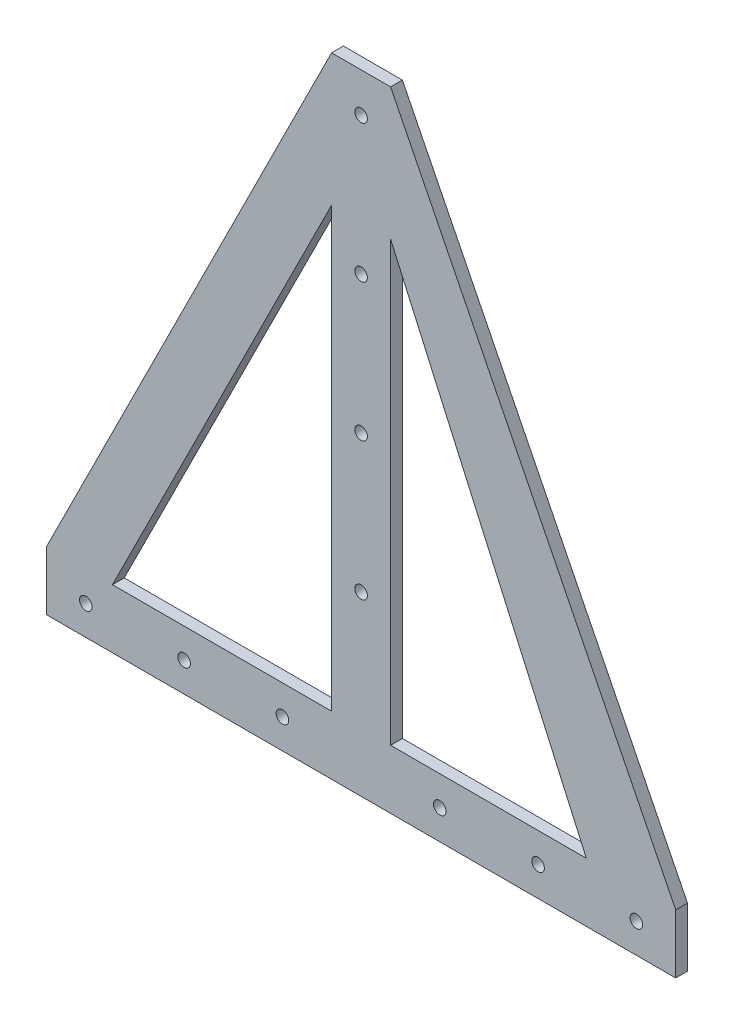
ISO-10303-21;
HEADER;
FILE_DESCRIPTION(('STEP AP214'),'2;1');
FILE_NAME('part.step','',(''),(''),'','','');
FILE_SCHEMA(('AUTOMOTIVE_DESIGN { 1 0 10303 214 1 1 1 1 }'));
ENDSEC;
DATA;
#1=APPLICATION_CONTEXT('core data for automotive mechanical design processes');
#2=APPLICATION_PROTOCOL_DEFINITION('international standard','automotive_design',2000,#1);
#3=PRODUCT_CONTEXT('',#1,'mechanical');
#4=PRODUCT('Part','Part','',(#3));
#5=PRODUCT_RELATED_PRODUCT_CATEGORY('part','',(#4));
#6=PRODUCT_DEFINITION_FORMATION('','',#4);
#7=PRODUCT_DEFINITION_CONTEXT('part definition',#1,'design');
#8=PRODUCT_DEFINITION('design','',#6,#7);
#9=PRODUCT_DEFINITION_SHAPE('','',#8);
#10=(LENGTH_UNIT() NAMED_UNIT(*) SI_UNIT(.MILLI.,.METRE.));
#11=(NAMED_UNIT(*) PLANE_ANGLE_UNIT() SI_UNIT($,.RADIAN.));
#12=(NAMED_UNIT(*) SI_UNIT($,.STERADIAN.) SOLID_ANGLE_UNIT());
#13=UNCERTAINTY_MEASURE_WITH_UNIT(LENGTH_MEASURE(1.E-05),#10,'distance_accuracy_value','');
#14=(GEOMETRIC_REPRESENTATION_CONTEXT(3) GLOBAL_UNCERTAINTY_ASSIGNED_CONTEXT((#13)) GLOBAL_UNIT_ASSIGNED_CONTEXT((#10,
#11,#12)) REPRESENTATION_CONTEXT('',''));
#15=CARTESIAN_POINT('',(0.,0.,0.));
#16=DIRECTION('',(0.,0.,1.));
#17=DIRECTION('',(1.,0.,0.));
#18=AXIS2_PLACEMENT_3D('',#15,#16,#17);
#19=CARTESIAN_POINT('',(0.,0.,3.));
#20=DIRECTION('',(0.,0.,-1.));
#21=DIRECTION('',(-1.,0.,0.));
#22=AXIS2_PLACEMENT_3D('',#19,#20,#21);
#23=PLANE('',#22);
#24=CARTESIAN_POINT('',(80.0000000000011,45.,3.));
#25=DIRECTION('',(0.,0.,1.));
#26=DIRECTION('',(1.,0.,0.));
#27=AXIS2_PLACEMENT_3D('',#24,#25,#26);
#28=CIRCLE('',#27,1.6);
#29=CARTESIAN_POINT('',(81.6000000000011,45.,3.));
#30=VERTEX_POINT('',#29);
#31=EDGE_CURVE('E149',#30,#30,#28,.T.);
#32=ORIENTED_EDGE('',*,*,#31,.F.);
#33=EDGE_LOOP('',(#32));
#34=FACE_BOUND('',#33,.T.);
#35=CARTESIAN_POINT('',(80.0000000000004,115.,3.));
#36=DIRECTION('',(0.,0.,1.));
#37=DIRECTION('',(1.,0.,0.));
#38=AXIS2_PLACEMENT_3D('',#35,#36,#37);
#39=CIRCLE('',#38,1.6);
#40=CARTESIAN_POINT('',(81.6000000000004,115.,3.));
#41=VERTEX_POINT('',#40);
#42=EDGE_CURVE('E161',#41,#41,#39,.T.);
#43=ORIENTED_EDGE('',*,*,#42,.F.);
#44=EDGE_LOOP('',(#43));
#45=FACE_BOUND('',#44,.T.);
#46=CARTESIAN_POINT('',(80.,150.,3.));
#47=DIRECTION('',(0.,0.,1.));
#48=DIRECTION('',(1.,0.,0.));
#49=AXIS2_PLACEMENT_3D('',#46,#47,#48);
#50=CIRCLE('',#49,1.6);
#51=CARTESIAN_POINT('',(81.6,150.,3.));
#52=VERTEX_POINT('',#51);
#53=EDGE_CURVE('E191',#52,#52,#50,.T.);
#54=ORIENTED_EDGE('',*,*,#53,.F.);
#55=EDGE_LOOP('',(#54));
#56=FACE_BOUND('',#55,.T.);
#57=CARTESIAN_POINT('',(35.,7.49999999999983,3.));
#58=DIRECTION('',(0.,0.,1.));
#59=DIRECTION('',(-1.,0.,0.));
#60=AXIS2_PLACEMENT_3D('',#57,#58,#59);
#61=CIRCLE('',#60,1.59999999999999);
#62=CARTESIAN_POINT('',(33.4,7.49999999999983,3.));
#63=VERTEX_POINT('',#62);
#64=EDGE_CURVE('E203',#63,#63,#61,.T.);
#65=ORIENTED_EDGE('',*,*,#64,.F.);
#66=EDGE_LOOP('',(#65));
#67=FACE_BOUND('',#66,.T.);
#68=CARTESIAN_POINT('',(125.,7.49999999999983,3.));
#69=DIRECTION('',(0.,0.,1.));
#70=DIRECTION('',(1.,0.,0.));
#71=AXIS2_PLACEMENT_3D('',#68,#69,#70);
#72=CIRCLE('',#71,1.59999999999999);
#73=CARTESIAN_POINT('',(126.6,7.49999999999983,3.));
#74=VERTEX_POINT('',#73);
#75=EDGE_CURVE('E215',#74,#74,#72,.T.);
#76=ORIENTED_EDGE('',*,*,#75,.F.);
#77=EDGE_LOOP('',(#76));
#78=FACE_BOUND('',#77,.T.);
#79=CARTESIAN_POINT('',(150.,7.5,3.));
#80=DIRECTION('',(0.,0.,1.));
#81=DIRECTION('',(1.,0.,0.));
#82=AXIS2_PLACEMENT_3D('',#79,#80,#81);
#83=CIRCLE('',#82,1.59999999999999);
#84=CARTESIAN_POINT('',(151.6,7.5,3.));
#85=VERTEX_POINT('',#84);
#86=EDGE_CURVE('E227',#85,#85,#83,.T.);
#87=ORIENTED_EDGE('',*,*,#86,.F.);
#88=EDGE_LOOP('',(#87));
#89=FACE_BOUND('',#88,.T.);
#90=DIRECTION('',(0.,-1.,0.));
#91=VECTOR('',#90,1.);
#92=CARTESIAN_POINT('',(0.,0.,3.));
#93=LINE('',#92,#91);
#94=CARTESIAN_POINT('',(0.,15.,3.));
#95=VERTEX_POINT('',#94);
#96=CARTESIAN_POINT('',(0.,0.,3.));
#97=VERTEX_POINT('',#96);
#98=EDGE_CURVE('E233',#95,#97,#93,.T.);
#99=ORIENTED_EDGE('',*,*,#98,.T.);
#100=DIRECTION('',(1.,0.,0.));
#101=VECTOR('',#100,1.);
#102=CARTESIAN_POINT('',(0.,0.,3.));
#103=LINE('',#102,#101);
#104=CARTESIAN_POINT('',(160.,0.,3.));
#105=VERTEX_POINT('',#104);
#106=EDGE_CURVE('E236',#97,#105,#103,.T.);
#107=ORIENTED_EDGE('',*,*,#106,.T.);
#108=DIRECTION('',(0.,1.,0.));
#109=VECTOR('',#108,1.);
#110=CARTESIAN_POINT('',(160.,0.,3.));
#111=LINE('',#110,#109);
#112=CARTESIAN_POINT('',(160.,15.,3.));
#113=VERTEX_POINT('',#112);
#114=EDGE_CURVE('E239',#105,#113,#111,.T.);
#115=ORIENTED_EDGE('',*,*,#114,.T.);
#116=DIRECTION('',(-0.447213595499958,0.894427190999916,0.));
#117=VECTOR('',#116,1.);
#118=CARTESIAN_POINT('',(87.5,160.,3.));
#119=LINE('',#118,#117);
#120=CARTESIAN_POINT('',(87.5,160.,3.));
#121=VERTEX_POINT('',#120);
#122=EDGE_CURVE('E241',#113,#121,#119,.T.);
#123=ORIENTED_EDGE('',*,*,#122,.T.);
#124=DIRECTION('',(-1.,0.,0.));
#125=VECTOR('',#124,1.);
#126=CARTESIAN_POINT('',(72.5,160.,3.));
#127=LINE('',#126,#125);
#128=CARTESIAN_POINT('',(72.5,160.,3.));
#129=VERTEX_POINT('',#128);
#130=EDGE_CURVE('E243',#121,#129,#127,.T.);
#131=ORIENTED_EDGE('',*,*,#130,.T.);
#132=DIRECTION('',(-0.447213595499958,-0.894427190999916,0.));
#133=VECTOR('',#132,1.);
#134=CARTESIAN_POINT('',(0.,15.,3.));
#135=LINE('',#134,#133);
#136=EDGE_CURVE('E245',#129,#95,#135,.T.);
#137=ORIENTED_EDGE('',*,*,#136,.T.);
#138=EDGE_LOOP('',(#99,#107,#115,#123,#131,#137));
#139=FACE_BOUND('',#138,.T.);
#140=CARTESIAN_POINT('',(10.,7.5,3.));
#141=DIRECTION('',(0.,0.,1.));
#142=DIRECTION('',(-1.,0.,0.));
#143=AXIS2_PLACEMENT_3D('',#140,#141,#142);
#144=CIRCLE('',#143,1.59999999999999);
#145=CARTESIAN_POINT('',(8.40000000000002,7.5,3.));
#146=VERTEX_POINT('',#145);
#147=EDGE_CURVE('E221',#146,#146,#144,.T.);
#148=ORIENTED_EDGE('',*,*,#147,.F.);
#149=EDGE_LOOP('',(#148));
#150=FACE_BOUND('',#149,.T.);
#151=CARTESIAN_POINT('',(100.,7.49999999999965,3.));
#152=DIRECTION('',(0.,0.,1.));
#153=DIRECTION('',(1.,0.,0.));
#154=AXIS2_PLACEMENT_3D('',#151,#152,#153);
#155=CIRCLE('',#154,1.59999999999999);
#156=CARTESIAN_POINT('',(101.6,7.49999999999965,3.));
#157=VERTEX_POINT('',#156);
#158=EDGE_CURVE('E209',#157,#157,#155,.T.);
#159=ORIENTED_EDGE('',*,*,#158,.F.);
#160=EDGE_LOOP('',(#159));
#161=FACE_BOUND('',#160,.T.);
#162=CARTESIAN_POINT('',(60.,7.49999999999965,3.));
#163=DIRECTION('',(0.,0.,1.));
#164=DIRECTION('',(-1.,0.,0.));
#165=AXIS2_PLACEMENT_3D('',#162,#163,#164);
#166=CIRCLE('',#165,1.59999999999999);
#167=CARTESIAN_POINT('',(58.4,7.49999999999965,3.));
#168=VERTEX_POINT('',#167);
#169=EDGE_CURVE('E197',#168,#168,#166,.T.);
#170=ORIENTED_EDGE('',*,*,#169,.F.);
#171=EDGE_LOOP('',(#170));
#172=FACE_BOUND('',#171,.T.);
#173=DIRECTION('',(-0.447213595499958,-0.894427190999916,0.));
#174=VECTOR('',#173,1.);
#175=CARTESIAN_POINT('',(16.7705098312484,15.,3.));
#176=LINE('',#175,#174);
#177=CARTESIAN_POINT('',(72.5,126.458980337503,3.));
#178=VERTEX_POINT('',#177);
#179=CARTESIAN_POINT('',(16.7705098312484,15.,3.));
#180=VERTEX_POINT('',#179);
#181=EDGE_CURVE('E167',#178,#180,#176,.T.);
#182=ORIENTED_EDGE('',*,*,#181,.F.);
#183=DIRECTION('',(0.,1.,0.));
#184=VECTOR('',#183,1.);
#185=CARTESIAN_POINT('',(72.5,126.458980337503,3.));
#186=LINE('',#185,#184);
#187=CARTESIAN_POINT('',(72.5,15.,3.));
#188=VERTEX_POINT('',#187);
#189=EDGE_CURVE('E173',#188,#178,#186,.T.);
#190=ORIENTED_EDGE('',*,*,#189,.F.);
#191=DIRECTION('',(1.,0.,0.));
#192=VECTOR('',#191,1.);
#193=CARTESIAN_POINT('',(72.5,15.,3.));
#194=LINE('',#193,#192);
#195=EDGE_CURVE('E169',#180,#188,#194,.T.);
#196=ORIENTED_EDGE('',*,*,#195,.F.);
#197=EDGE_LOOP('',(#182,#190,#196));
#198=FACE_BOUND('',#197,.T.);
#199=CARTESIAN_POINT('',(80.0000000000007,80.,3.));
#200=DIRECTION('',(0.,0.,1.));
#201=DIRECTION('',(1.,0.,0.));
#202=AXIS2_PLACEMENT_3D('',#199,#200,#201);
#203=CIRCLE('',#202,1.6);
#204=CARTESIAN_POINT('',(81.6000000000007,80.,3.));
#205=VERTEX_POINT('',#204);
#206=EDGE_CURVE('E155',#205,#205,#203,.T.);
#207=ORIENTED_EDGE('',*,*,#206,.F.);
#208=EDGE_LOOP('',(#207));
#209=FACE_BOUND('',#208,.T.);
#210=DIRECTION('',(0.,-1.,0.));
#211=VECTOR('',#210,1.);
#212=CARTESIAN_POINT('',(87.5,126.458980337503,3.));
#213=LINE('',#212,#211);
#214=CARTESIAN_POINT('',(87.5,126.458980337503,3.));
#215=VERTEX_POINT('',#214);
#216=CARTESIAN_POINT('',(87.5,15.,3.));
#217=VERTEX_POINT('',#216);
#218=EDGE_CURVE('E122',#215,#217,#213,.T.);
#219=ORIENTED_EDGE('',*,*,#218,.F.);
#220=DIRECTION('',(-0.407739813546904,0.913098157072248,0.));
#221=VECTOR('',#220,1.);
#222=CARTESIAN_POINT('',(137.271498834978,15.,3.));
#223=LINE('',#222,#221);
#224=CARTESIAN_POINT('',(137.271498834978,15.,3.));
#225=VERTEX_POINT('',#224);
#226=EDGE_CURVE('E139',#225,#215,#223,.T.);
#227=ORIENTED_EDGE('',*,*,#226,.F.);
#228=DIRECTION('',(1.,0.,0.));
#229=VECTOR('',#228,1.);
#230=CARTESIAN_POINT('',(87.5,15.,3.));
#231=LINE('',#230,#229);
#232=EDGE_CURVE('E130',#217,#225,#231,.T.);
#233=ORIENTED_EDGE('',*,*,#232,.F.);
#234=EDGE_LOOP('',(#219,#227,#233));
#235=FACE_BOUND('',#234,.T.);
#236=ADVANCED_FACE('F33',(#34,#45,#56,#67,#78,#89,#139,#150,#161,#172,#198,#209,#235),#23,.F.);
#237=CARTESIAN_POINT('',(0.,0.,0.));
#238=DIRECTION('',(0.,0.,-1.));
#239=DIRECTION('',(-1.,0.,0.));
#240=AXIS2_PLACEMENT_3D('',#237,#238,#239);
#241=PLANE('',#240);
#242=CARTESIAN_POINT('',(80.0000000000011,45.,0.));
#243=DIRECTION('',(0.,0.,1.));
#244=DIRECTION('',(1.,0.,0.));
#245=AXIS2_PLACEMENT_3D('',#242,#243,#244);
#246=CIRCLE('',#245,1.6);
#247=CARTESIAN_POINT('',(81.6000000000011,45.,0.));
#248=VERTEX_POINT('',#247);
#249=EDGE_CURVE('E137',#248,#248,#246,.T.);
#250=ORIENTED_EDGE('',*,*,#249,.T.);
#251=EDGE_LOOP('',(#250));
#252=FACE_BOUND('',#251,.T.);
#253=CARTESIAN_POINT('',(80.0000000000004,115.,0.));
#254=DIRECTION('',(0.,0.,1.));
#255=DIRECTION('',(1.,0.,0.));
#256=AXIS2_PLACEMENT_3D('',#253,#254,#255);
#257=CIRCLE('',#256,1.6);
#258=CARTESIAN_POINT('',(81.6000000000004,115.,0.));
#259=VERTEX_POINT('',#258);
#260=EDGE_CURVE('E158',#259,#259,#257,.T.);
#261=ORIENTED_EDGE('',*,*,#260,.T.);
#262=EDGE_LOOP('',(#261));
#263=FACE_BOUND('',#262,.T.);
#264=CARTESIAN_POINT('',(80.,150.,0.));
#265=DIRECTION('',(0.,0.,1.));
#266=DIRECTION('',(1.,0.,0.));
#267=AXIS2_PLACEMENT_3D('',#264,#265,#266);
#268=CIRCLE('',#267,1.6);
#269=CARTESIAN_POINT('',(81.6,150.,0.));
#270=VERTEX_POINT('',#269);
#271=EDGE_CURVE('E190',#270,#270,#268,.T.);
#272=ORIENTED_EDGE('',*,*,#271,.T.);
#273=EDGE_LOOP('',(#272));
#274=FACE_BOUND('',#273,.T.);
#275=CARTESIAN_POINT('',(35.,7.49999999999983,0.));
#276=DIRECTION('',(0.,0.,1.));
#277=DIRECTION('',(-1.,0.,0.));
#278=AXIS2_PLACEMENT_3D('',#275,#276,#277);
#279=CIRCLE('',#278,1.59999999999999);
#280=CARTESIAN_POINT('',(33.4,7.49999999999983,0.));
#281=VERTEX_POINT('',#280);
#282=EDGE_CURVE('E200',#281,#281,#279,.T.);
#283=ORIENTED_EDGE('',*,*,#282,.T.);
#284=EDGE_LOOP('',(#283));
#285=FACE_BOUND('',#284,.T.);
#286=CARTESIAN_POINT('',(125.,7.49999999999983,0.));
#287=DIRECTION('',(0.,0.,1.));
#288=DIRECTION('',(1.,0.,0.));
#289=AXIS2_PLACEMENT_3D('',#286,#287,#288);
#290=CIRCLE('',#289,1.59999999999999);
#291=CARTESIAN_POINT('',(126.6,7.49999999999983,0.));
#292=VERTEX_POINT('',#291);
#293=EDGE_CURVE('E212',#292,#292,#290,.T.);
#294=ORIENTED_EDGE('',*,*,#293,.T.);
#295=EDGE_LOOP('',(#294));
#296=FACE_BOUND('',#295,.T.);
#297=CARTESIAN_POINT('',(150.,7.5,0.));
#298=DIRECTION('',(0.,0.,1.));
#299=DIRECTION('',(1.,0.,0.));
#300=AXIS2_PLACEMENT_3D('',#297,#298,#299);
#301=CIRCLE('',#300,1.59999999999999);
#302=CARTESIAN_POINT('',(151.6,7.5,0.));
#303=VERTEX_POINT('',#302);
#304=EDGE_CURVE('E224',#303,#303,#301,.T.);
#305=ORIENTED_EDGE('',*,*,#304,.T.);
#306=EDGE_LOOP('',(#305));
#307=FACE_BOUND('',#306,.T.);
#308=DIRECTION('',(0.,-1.,0.));
#309=VECTOR('',#308,1.);
#310=CARTESIAN_POINT('',(0.,0.,0.));
#311=LINE('',#310,#309);
#312=CARTESIAN_POINT('',(0.,15.,0.));
#313=VERTEX_POINT('',#312);
#314=CARTESIAN_POINT('',(0.,0.,0.));
#315=VERTEX_POINT('',#314);
#316=EDGE_CURVE('E230',#313,#315,#311,.T.);
#317=ORIENTED_EDGE('',*,*,#316,.F.);
#318=DIRECTION('',(-0.447213595499958,-0.894427190999916,0.));
#319=VECTOR('',#318,1.);
#320=CARTESIAN_POINT('',(0.,15.,0.));
#321=LINE('',#320,#319);
#322=CARTESIAN_POINT('',(72.5,160.,0.));
#323=VERTEX_POINT('',#322);
#324=EDGE_CURVE('E237',#323,#313,#321,.T.);
#325=ORIENTED_EDGE('',*,*,#324,.F.);
#326=DIRECTION('',(-1.,0.,0.));
#327=VECTOR('',#326,1.);
#328=CARTESIAN_POINT('',(72.5,160.,0.));
#329=LINE('',#328,#327);
#330=CARTESIAN_POINT('',(87.5,160.,0.));
#331=VERTEX_POINT('',#330);
#332=EDGE_CURVE('E256',#331,#323,#329,.T.);
#333=ORIENTED_EDGE('',*,*,#332,.F.);
#334=DIRECTION('',(-0.447213595499958,0.894427190999916,0.));
#335=VECTOR('',#334,1.);
#336=CARTESIAN_POINT('',(87.5,160.,0.));
#337=LINE('',#336,#335);
#338=CARTESIAN_POINT('',(160.,15.,0.));
#339=VERTEX_POINT('',#338);
#340=EDGE_CURVE('E254',#339,#331,#337,.T.);
#341=ORIENTED_EDGE('',*,*,#340,.F.);
#342=DIRECTION('',(0.,1.,0.));
#343=VECTOR('',#342,1.);
#344=CARTESIAN_POINT('',(160.,0.,0.));
#345=LINE('',#344,#343);
#346=CARTESIAN_POINT('',(160.,0.,0.));
#347=VERTEX_POINT('',#346);
#348=EDGE_CURVE('E252',#347,#339,#345,.T.);
#349=ORIENTED_EDGE('',*,*,#348,.F.);
#350=DIRECTION('',(1.,0.,0.));
#351=VECTOR('',#350,1.);
#352=CARTESIAN_POINT('',(0.,0.,0.));
#353=LINE('',#352,#351);
#354=EDGE_CURVE('E250',#315,#347,#353,.T.);
#355=ORIENTED_EDGE('',*,*,#354,.F.);
#356=EDGE_LOOP('',(#317,#325,#333,#341,#349,#355));
#357=FACE_BOUND('',#356,.T.);
#358=CARTESIAN_POINT('',(10.,7.5,0.));
#359=DIRECTION('',(0.,0.,1.));
#360=DIRECTION('',(-1.,0.,0.));
#361=AXIS2_PLACEMENT_3D('',#358,#359,#360);
#362=CIRCLE('',#361,1.59999999999999);
#363=CARTESIAN_POINT('',(8.40000000000002,7.5,0.));
#364=VERTEX_POINT('',#363);
#365=EDGE_CURVE('E218',#364,#364,#362,.T.);
#366=ORIENTED_EDGE('',*,*,#365,.T.);
#367=EDGE_LOOP('',(#366));
#368=FACE_BOUND('',#367,.T.);
#369=CARTESIAN_POINT('',(100.,7.49999999999965,0.));
#370=DIRECTION('',(0.,0.,1.));
#371=DIRECTION('',(1.,0.,0.));
#372=AXIS2_PLACEMENT_3D('',#369,#370,#371);
#373=CIRCLE('',#372,1.59999999999999);
#374=CARTESIAN_POINT('',(101.6,7.49999999999965,0.));
#375=VERTEX_POINT('',#374);
#376=EDGE_CURVE('E206',#375,#375,#373,.T.);
#377=ORIENTED_EDGE('',*,*,#376,.T.);
#378=EDGE_LOOP('',(#377));
#379=FACE_BOUND('',#378,.T.);
#380=CARTESIAN_POINT('',(60.,7.49999999999965,0.));
#381=DIRECTION('',(0.,0.,1.));
#382=DIRECTION('',(-1.,0.,0.));
#383=AXIS2_PLACEMENT_3D('',#380,#381,#382);
#384=CIRCLE('',#383,1.59999999999999);
#385=CARTESIAN_POINT('',(58.4,7.49999999999965,0.));
#386=VERTEX_POINT('',#385);
#387=EDGE_CURVE('E194',#386,#386,#384,.T.);
#388=ORIENTED_EDGE('',*,*,#387,.T.);
#389=EDGE_LOOP('',(#388));
#390=FACE_BOUND('',#389,.T.);
#391=DIRECTION('',(0.,1.,0.));
#392=VECTOR('',#391,1.);
#393=CARTESIAN_POINT('',(72.5,126.458980337503,0.));
#394=LINE('',#393,#392);
#395=CARTESIAN_POINT('',(72.5,15.,0.));
#396=VERTEX_POINT('',#395);
#397=CARTESIAN_POINT('',(72.5,126.458980337503,0.));
#398=VERTEX_POINT('',#397);
#399=EDGE_CURVE('E170',#396,#398,#394,.T.);
#400=ORIENTED_EDGE('',*,*,#399,.T.);
#401=DIRECTION('',(-0.447213595499958,-0.894427190999916,0.));
#402=VECTOR('',#401,1.);
#403=CARTESIAN_POINT('',(16.7705098312484,15.,0.));
#404=LINE('',#403,#402);
#405=CARTESIAN_POINT('',(16.7705098312484,15.,0.));
#406=VERTEX_POINT('',#405);
#407=EDGE_CURVE('E164',#398,#406,#404,.T.);
#408=ORIENTED_EDGE('',*,*,#407,.T.);
#409=DIRECTION('',(1.,0.,0.));
#410=VECTOR('',#409,1.);
#411=CARTESIAN_POINT('',(72.5,15.,0.));
#412=LINE('',#411,#410);
#413=EDGE_CURVE('E178',#406,#396,#412,.T.);
#414=ORIENTED_EDGE('',*,*,#413,.T.);
#415=EDGE_LOOP('',(#400,#408,#414));
#416=FACE_BOUND('',#415,.T.);
#417=CARTESIAN_POINT('',(80.0000000000007,80.,0.));
#418=DIRECTION('',(0.,0.,1.));
#419=DIRECTION('',(1.,0.,0.));
#420=AXIS2_PLACEMENT_3D('',#417,#418,#419);
#421=CIRCLE('',#420,1.6);
#422=CARTESIAN_POINT('',(81.6000000000007,80.,0.));
#423=VERTEX_POINT('',#422);
#424=EDGE_CURVE('E152',#423,#423,#421,.T.);
#425=ORIENTED_EDGE('',*,*,#424,.T.);
#426=EDGE_LOOP('',(#425));
#427=FACE_BOUND('',#426,.T.);
#428=DIRECTION('',(-0.407739813546904,0.913098157072248,0.));
#429=VECTOR('',#428,1.);
#430=CARTESIAN_POINT('',(137.271498834978,15.,0.));
#431=LINE('',#430,#429);
#432=CARTESIAN_POINT('',(137.271498834978,15.,0.));
#433=VERTEX_POINT('',#432);
#434=CARTESIAN_POINT('',(87.5,126.458980337503,0.));
#435=VERTEX_POINT('',#434);
#436=EDGE_CURVE('E131',#433,#435,#431,.T.);
#437=ORIENTED_EDGE('',*,*,#436,.T.);
#438=DIRECTION('',(0.,-1.,0.));
#439=VECTOR('',#438,1.);
#440=CARTESIAN_POINT('',(87.5,126.458980337503,0.));
#441=LINE('',#440,#439);
#442=CARTESIAN_POINT('',(87.5,15.,0.));
#443=VERTEX_POINT('',#442);
#444=EDGE_CURVE('E56',#435,#443,#441,.T.);
#445=ORIENTED_EDGE('',*,*,#444,.T.);
#446=DIRECTION('',(1.,0.,0.));
#447=VECTOR('',#446,1.);
#448=CARTESIAN_POINT('',(87.5,15.,0.));
#449=LINE('',#448,#447);
#450=EDGE_CURVE('E136',#443,#433,#449,.T.);
#451=ORIENTED_EDGE('',*,*,#450,.T.);
#452=EDGE_LOOP('',(#437,#445,#451));
#453=FACE_BOUND('',#452,.T.);
#454=ADVANCED_FACE('F280',(#252,#263,#274,#285,#296,#307,#357,#368,#379,#390,#416,#427,#453),
#241,.T.);
#455=CARTESIAN_POINT('',(0.,0.,3.));
#456=DIRECTION('',(1.,0.,0.));
#457=DIRECTION('',(0.,0.,-1.));
#458=AXIS2_PLACEMENT_3D('',#455,#456,#457);
#459=PLANE('',#458);
#460=ORIENTED_EDGE('',*,*,#316,.T.);
#461=DIRECTION('',(0.,0.,-1.));
#462=VECTOR('',#461,1.);
#463=CARTESIAN_POINT('',(0.,0.,3.));
#464=LINE('',#463,#462);
#465=EDGE_CURVE('E11',#97,#315,#464,.T.);
#466=ORIENTED_EDGE('',*,*,#465,.F.);
#467=ORIENTED_EDGE('',*,*,#98,.F.);
#468=DIRECTION('',(0.,0.,-1.));
#469=VECTOR('',#468,1.);
#470=CARTESIAN_POINT('',(0.,15.,3.));
#471=LINE('',#470,#469);
#472=EDGE_CURVE('E247',#95,#313,#471,.T.);
#473=ORIENTED_EDGE('',*,*,#472,.T.);
#474=EDGE_LOOP('',(#460,#466,#467,#473));
#475=FACE_BOUND('',#474,.T.);
#476=ADVANCED_FACE('F35',(#475),#459,.F.);
#477=CARTESIAN_POINT('',(0.,0.,3.));
#478=DIRECTION('',(0.,1.,0.));
#479=DIRECTION('',(0.,0.,1.));
#480=AXIS2_PLACEMENT_3D('',#477,#478,#479);
#481=PLANE('',#480);
#482=ORIENTED_EDGE('',*,*,#354,.T.);
#483=DIRECTION('',(0.,0.,-1.));
#484=VECTOR('',#483,1.);
#485=CARTESIAN_POINT('',(160.,0.,3.));
#486=LINE('',#485,#484);
#487=EDGE_CURVE('E41',#105,#347,#486,.T.);
#488=ORIENTED_EDGE('',*,*,#487,.F.);
#489=ORIENTED_EDGE('',*,*,#106,.F.);
#490=ORIENTED_EDGE('',*,*,#465,.T.);
#491=EDGE_LOOP('',(#482,#488,#489,#490));
#492=FACE_BOUND('',#491,.T.);
#493=ADVANCED_FACE('F298',(#492),#481,.F.);
#494=CARTESIAN_POINT('',(160.,0.,3.));
#495=DIRECTION('',(-1.,0.,0.));
#496=DIRECTION('',(0.,0.,1.));
#497=AXIS2_PLACEMENT_3D('',#494,#495,#496);
#498=PLANE('',#497);
#499=ORIENTED_EDGE('',*,*,#348,.T.);
#500=DIRECTION('',(0.,0.,-1.));
#501=VECTOR('',#500,1.);
#502=CARTESIAN_POINT('',(160.,15.,3.));
#503=LINE('',#502,#501);
#504=EDGE_CURVE('E267',#113,#339,#503,.T.);
#505=ORIENTED_EDGE('',*,*,#504,.F.);
#506=ORIENTED_EDGE('',*,*,#114,.F.);
#507=ORIENTED_EDGE('',*,*,#487,.T.);
#508=EDGE_LOOP('',(#499,#505,#506,#507));
#509=FACE_BOUND('',#508,.T.);
#510=ADVANCED_FACE('F274',(#509),#498,.F.);
#511=CARTESIAN_POINT('',(87.5,160.,3.));
#512=DIRECTION('',(-0.894427190999916,-0.447213595499958,0.));
#513=DIRECTION('',(0.447213595499958,-0.894427190999916,0.));
#514=AXIS2_PLACEMENT_3D('',#511,#512,#513);
#515=PLANE('',#514);
#516=ORIENTED_EDGE('',*,*,#340,.T.);
#517=DIRECTION('',(0.,0.,-1.));
#518=VECTOR('',#517,1.);
#519=CARTESIAN_POINT('',(87.5,160.,3.));
#520=LINE('',#519,#518);
#521=EDGE_CURVE('E264',#121,#331,#520,.T.);
#522=ORIENTED_EDGE('',*,*,#521,.F.);
#523=ORIENTED_EDGE('',*,*,#122,.F.);
#524=ORIENTED_EDGE('',*,*,#504,.T.);
#525=EDGE_LOOP('',(#516,#522,#523,#524));
#526=FACE_BOUND('',#525,.T.);
#527=ADVANCED_FACE('F286',(#526),#515,.F.);
#528=CARTESIAN_POINT('',(72.5,160.,3.));
#529=DIRECTION('',(0.,-1.,0.));
#530=DIRECTION('',(0.,0.,-1.));
#531=AXIS2_PLACEMENT_3D('',#528,#529,#530);
#532=PLANE('',#531);
#533=ORIENTED_EDGE('',*,*,#332,.T.);
#534=DIRECTION('',(0.,0.,-1.));
#535=VECTOR('',#534,1.);
#536=CARTESIAN_POINT('',(72.5,160.,3.));
#537=LINE('',#536,#535);
#538=EDGE_CURVE('E261',#129,#323,#537,.T.);
#539=ORIENTED_EDGE('',*,*,#538,.F.);
#540=ORIENTED_EDGE('',*,*,#130,.F.);
#541=ORIENTED_EDGE('',*,*,#521,.T.);
#542=EDGE_LOOP('',(#533,#539,#540,#541));
#543=FACE_BOUND('',#542,.T.);
#544=ADVANCED_FACE('F290',(#543),#532,.F.);
#545=CARTESIAN_POINT('',(0.,15.,3.));
#546=DIRECTION('',(0.894427190999916,-0.447213595499958,0.));
#547=DIRECTION('',(0.447213595499958,0.894427190999916,0.));
#548=AXIS2_PLACEMENT_3D('',#545,#546,#547);
#549=PLANE('',#548);
#550=ORIENTED_EDGE('',*,*,#324,.T.);
#551=ORIENTED_EDGE('',*,*,#472,.F.);
#552=ORIENTED_EDGE('',*,*,#136,.F.);
#553=ORIENTED_EDGE('',*,*,#538,.T.);
#554=EDGE_LOOP('',(#550,#551,#552,#553));
#555=FACE_BOUND('',#554,.T.);
#556=ADVANCED_FACE('F301',(#555),#549,.F.);
#557=CARTESIAN_POINT('',(150.,7.5,3.));
#558=DIRECTION('',(0.,0.,-1.));
#559=DIRECTION('',(-1.,0.,0.));
#560=AXIS2_PLACEMENT_3D('',#557,#558,#559);
#561=CYLINDRICAL_SURFACE('',#560,1.59999999999999);
#562=ORIENTED_EDGE('',*,*,#86,.T.);
#563=EDGE_LOOP('',(#562));
#564=FACE_BOUND('',#563,.T.);
#565=ORIENTED_EDGE('',*,*,#304,.F.);
#566=EDGE_LOOP('',(#565));
#567=FACE_BOUND('',#566,.T.);
#568=ADVANCED_FACE('F303',(#564,#567),#561,.F.);
#569=CARTESIAN_POINT('',(10.,7.5,3.));
#570=DIRECTION('',(0.,0.,-1.));
#571=DIRECTION('',(-1.,0.,0.));
#572=AXIS2_PLACEMENT_3D('',#569,#570,#571);
#573=CYLINDRICAL_SURFACE('',#572,1.59999999999999);
#574=ORIENTED_EDGE('',*,*,#147,.T.);
#575=EDGE_LOOP('',(#574));
#576=FACE_BOUND('',#575,.T.);
#577=ORIENTED_EDGE('',*,*,#365,.F.);
#578=EDGE_LOOP('',(#577));
#579=FACE_BOUND('',#578,.T.);
#580=ADVANCED_FACE('F309',(#576,#579),#573,.F.);
#581=CARTESIAN_POINT('',(125.,7.49999999999983,3.));
#582=DIRECTION('',(0.,0.,-1.));
#583=DIRECTION('',(-1.,0.,0.));
#584=AXIS2_PLACEMENT_3D('',#581,#582,#583);
#585=CYLINDRICAL_SURFACE('',#584,1.59999999999999);
#586=ORIENTED_EDGE('',*,*,#75,.T.);
#587=EDGE_LOOP('',(#586));
#588=FACE_BOUND('',#587,.T.);
#589=ORIENTED_EDGE('',*,*,#293,.F.);
#590=EDGE_LOOP('',(#589));
#591=FACE_BOUND('',#590,.T.);
#592=ADVANCED_FACE('F326',(#588,#591),#585,.F.);
#593=CARTESIAN_POINT('',(100.,7.49999999999965,3.));
#594=DIRECTION('',(0.,0.,-1.));
#595=DIRECTION('',(-1.,0.,0.));
#596=AXIS2_PLACEMENT_3D('',#593,#594,#595);
#597=CYLINDRICAL_SURFACE('',#596,1.59999999999999);
#598=ORIENTED_EDGE('',*,*,#158,.T.);
#599=EDGE_LOOP('',(#598));
#600=FACE_BOUND('',#599,.T.);
#601=ORIENTED_EDGE('',*,*,#376,.F.);
#602=EDGE_LOOP('',(#601));
#603=FACE_BOUND('',#602,.T.);
#604=ADVANCED_FACE('F330',(#600,#603),#597,.F.);
#605=CARTESIAN_POINT('',(35.,7.49999999999983,3.));
#606=DIRECTION('',(0.,0.,-1.));
#607=DIRECTION('',(-1.,0.,0.));
#608=AXIS2_PLACEMENT_3D('',#605,#606,#607);
#609=CYLINDRICAL_SURFACE('',#608,1.59999999999999);
#610=ORIENTED_EDGE('',*,*,#64,.T.);
#611=EDGE_LOOP('',(#610));
#612=FACE_BOUND('',#611,.T.);
#613=ORIENTED_EDGE('',*,*,#282,.F.);
#614=EDGE_LOOP('',(#613));
#615=FACE_BOUND('',#614,.T.);
#616=ADVANCED_FACE('F334',(#612,#615),#609,.F.);
#617=CARTESIAN_POINT('',(60.,7.49999999999965,3.));
#618=DIRECTION('',(0.,0.,-1.));
#619=DIRECTION('',(-1.,0.,0.));
#620=AXIS2_PLACEMENT_3D('',#617,#618,#619);
#621=CYLINDRICAL_SURFACE('',#620,1.59999999999999);
#622=ORIENTED_EDGE('',*,*,#169,.T.);
#623=EDGE_LOOP('',(#622));
#624=FACE_BOUND('',#623,.T.);
#625=ORIENTED_EDGE('',*,*,#387,.F.);
#626=EDGE_LOOP('',(#625));
#627=FACE_BOUND('',#626,.T.);
#628=ADVANCED_FACE('F338',(#624,#627),#621,.F.);
#629=CARTESIAN_POINT('',(80.,150.,3.));
#630=DIRECTION('',(0.,0.,-1.));
#631=DIRECTION('',(-1.,0.,0.));
#632=AXIS2_PLACEMENT_3D('',#629,#630,#631);
#633=CYLINDRICAL_SURFACE('',#632,1.6);
#634=ORIENTED_EDGE('',*,*,#53,.T.);
#635=EDGE_LOOP('',(#634));
#636=FACE_BOUND('',#635,.T.);
#637=ORIENTED_EDGE('',*,*,#271,.F.);
#638=EDGE_LOOP('',(#637));
#639=FACE_BOUND('',#638,.T.);
#640=ADVANCED_FACE('F342',(#636,#639),#633,.F.);
#641=CARTESIAN_POINT('',(16.7705098312484,15.,3.));
#642=DIRECTION('',(0.894427190999916,-0.447213595499958,0.));
#643=DIRECTION('',(0.447213595499958,0.894427190999916,0.));
#644=AXIS2_PLACEMENT_3D('',#641,#642,#643);
#645=PLANE('',#644);
#646=ORIENTED_EDGE('',*,*,#407,.F.);
#647=DIRECTION('',(0.,0.,-1.));
#648=VECTOR('',#647,1.);
#649=CARTESIAN_POINT('',(72.5,126.458980337503,3.));
#650=LINE('',#649,#648);
#651=EDGE_CURVE('E175',#178,#398,#650,.T.);
#652=ORIENTED_EDGE('',*,*,#651,.F.);
#653=ORIENTED_EDGE('',*,*,#181,.T.);
#654=DIRECTION('',(0.,0.,-1.));
#655=VECTOR('',#654,1.);
#656=CARTESIAN_POINT('',(16.7705098312484,15.,3.));
#657=LINE('',#656,#655);
#658=EDGE_CURVE('E187',#180,#406,#657,.T.);
#659=ORIENTED_EDGE('',*,*,#658,.T.);
#660=EDGE_LOOP('',(#646,#652,#653,#659));
#661=FACE_BOUND('',#660,.T.);
#662=ADVANCED_FACE('F346',(#661),#645,.T.);
#663=CARTESIAN_POINT('',(72.5,15.,3.));
#664=DIRECTION('',(0.,1.,0.));
#665=DIRECTION('',(-1.,0.,0.));
#666=AXIS2_PLACEMENT_3D('',#663,#664,#665);
#667=PLANE('',#666);
#668=ORIENTED_EDGE('',*,*,#413,.F.);
#669=ORIENTED_EDGE('',*,*,#658,.F.);
#670=ORIENTED_EDGE('',*,*,#195,.T.);
#671=DIRECTION('',(0.,0.,-1.));
#672=VECTOR('',#671,1.);
#673=CARTESIAN_POINT('',(72.5,15.,3.));
#674=LINE('',#673,#672);
#675=EDGE_CURVE('E185',#188,#396,#674,.T.);
#676=ORIENTED_EDGE('',*,*,#675,.T.);
#677=EDGE_LOOP('',(#668,#669,#670,#676));
#678=FACE_BOUND('',#677,.T.);
#679=ADVANCED_FACE('F350',(#678),#667,.T.);
#680=CARTESIAN_POINT('',(72.5,126.458980337503,3.));
#681=DIRECTION('',(-1.,0.,0.));
#682=DIRECTION('',(0.,0.,1.));
#683=AXIS2_PLACEMENT_3D('',#680,#681,#682);
#684=PLANE('',#683);
#685=ORIENTED_EDGE('',*,*,#399,.F.);
#686=ORIENTED_EDGE('',*,*,#675,.F.);
#687=ORIENTED_EDGE('',*,*,#189,.T.);
#688=ORIENTED_EDGE('',*,*,#651,.T.);
#689=EDGE_LOOP('',(#685,#686,#687,#688));
#690=FACE_BOUND('',#689,.T.);
#691=ADVANCED_FACE('F354',(#690),#684,.T.);
#692=CARTESIAN_POINT('',(80.0000000000004,115.,3.));
#693=DIRECTION('',(0.,0.,-1.));
#694=DIRECTION('',(-1.,0.,0.));
#695=AXIS2_PLACEMENT_3D('',#692,#693,#694);
#696=CYLINDRICAL_SURFACE('',#695,1.6);
#697=ORIENTED_EDGE('',*,*,#42,.T.);
#698=EDGE_LOOP('',(#697));
#699=FACE_BOUND('',#698,.T.);
#700=ORIENTED_EDGE('',*,*,#260,.F.);
#701=EDGE_LOOP('',(#700));
#702=FACE_BOUND('',#701,.T.);
#703=ADVANCED_FACE('F358',(#699,#702),#696,.F.);
#704=CARTESIAN_POINT('',(80.0000000000007,80.,3.));
#705=DIRECTION('',(0.,0.,-1.));
#706=DIRECTION('',(-1.,0.,0.));
#707=AXIS2_PLACEMENT_3D('',#704,#705,#706);
#708=CYLINDRICAL_SURFACE('',#707,1.6);
#709=ORIENTED_EDGE('',*,*,#206,.T.);
#710=EDGE_LOOP('',(#709));
#711=FACE_BOUND('',#710,.T.);
#712=ORIENTED_EDGE('',*,*,#424,.F.);
#713=EDGE_LOOP('',(#712));
#714=FACE_BOUND('',#713,.T.);
#715=ADVANCED_FACE('F362',(#711,#714),#708,.F.);
#716=CARTESIAN_POINT('',(80.0000000000011,45.,3.));
#717=DIRECTION('',(0.,0.,-1.));
#718=DIRECTION('',(-1.,0.,0.));
#719=AXIS2_PLACEMENT_3D('',#716,#717,#718);
#720=CYLINDRICAL_SURFACE('',#719,1.6);
#721=ORIENTED_EDGE('',*,*,#31,.T.);
#722=EDGE_LOOP('',(#721));
#723=FACE_BOUND('',#722,.T.);
#724=ORIENTED_EDGE('',*,*,#249,.F.);
#725=EDGE_LOOP('',(#724));
#726=FACE_BOUND('',#725,.T.);
#727=ADVANCED_FACE('F366',(#723,#726),#720,.F.);
#728=CARTESIAN_POINT('',(87.5,126.458980337503,3.));
#729=DIRECTION('',(1.,0.,0.));
#730=DIRECTION('',(0.,0.,-1.));
#731=AXIS2_PLACEMENT_3D('',#728,#729,#730);
#732=PLANE('',#731);
#733=ORIENTED_EDGE('',*,*,#444,.F.);
#734=DIRECTION('',(0.,0.,-1.));
#735=VECTOR('',#734,1.);
#736=CARTESIAN_POINT('',(87.5,126.458980337503,3.));
#737=LINE('',#736,#735);
#738=EDGE_CURVE('E126',#215,#435,#737,.T.);
#739=ORIENTED_EDGE('',*,*,#738,.F.);
#740=ORIENTED_EDGE('',*,*,#218,.T.);
#741=DIRECTION('',(0.,0.,-1.));
#742=VECTOR('',#741,1.);
#743=CARTESIAN_POINT('',(87.5,15.,3.));
#744=LINE('',#743,#742);
#745=EDGE_CURVE('E125',#217,#443,#744,.T.);
#746=ORIENTED_EDGE('',*,*,#745,.T.);
#747=EDGE_LOOP('',(#733,#739,#740,#746));
#748=FACE_BOUND('',#747,.T.);
#749=ADVANCED_FACE('F124',(#748),#732,.T.);
#750=CARTESIAN_POINT('',(87.5,15.,3.));
#751=DIRECTION('',(0.,1.,0.));
#752=DIRECTION('',(-1.,0.,0.));
#753=AXIS2_PLACEMENT_3D('',#750,#751,#752);
#754=PLANE('',#753);
#755=ORIENTED_EDGE('',*,*,#450,.F.);
#756=ORIENTED_EDGE('',*,*,#745,.F.);
#757=ORIENTED_EDGE('',*,*,#232,.T.);
#758=DIRECTION('',(0.,0.,-1.));
#759=VECTOR('',#758,1.);
#760=CARTESIAN_POINT('',(137.271498834978,15.,3.));
#761=LINE('',#760,#759);
#762=EDGE_CURVE('E48',#225,#433,#761,.T.);
#763=ORIENTED_EDGE('',*,*,#762,.T.);
#764=EDGE_LOOP('',(#755,#756,#757,#763));
#765=FACE_BOUND('',#764,.T.);
#766=ADVANCED_FACE('F134',(#765),#754,.T.);
#767=CARTESIAN_POINT('',(137.271498834978,15.,3.));
#768=DIRECTION('',(-0.913098157072248,-0.407739813546904,0.));
#769=DIRECTION('',(0.407739813546904,-0.913098157072248,0.));
#770=AXIS2_PLACEMENT_3D('',#767,#768,#769);
#771=PLANE('',#770);
#772=ORIENTED_EDGE('',*,*,#436,.F.);
#773=ORIENTED_EDGE('',*,*,#762,.F.);
#774=ORIENTED_EDGE('',*,*,#226,.T.);
#775=ORIENTED_EDGE('',*,*,#738,.T.);
#776=EDGE_LOOP('',(#772,#773,#774,#775));
#777=FACE_BOUND('',#776,.T.);
#778=ADVANCED_FACE('F375',(#777),#771,.T.);
#779=CLOSED_SHELL('',(#236,#454,#476,#493,#510,#527,#544,#556,#568,#580,#592,#604,#616,#628,
#640,#662,#679,#691,#703,#715,#727,#749,#766,#778));
#780=MANIFOLD_SOLID_BREP('B2',#779);
#781=ADVANCED_BREP_SHAPE_REPRESENTATION('',(#18,#780),#14);
#782=SHAPE_DEFINITION_REPRESENTATION(#9,#781);
ENDSEC;
END-ISO-10303-21;
